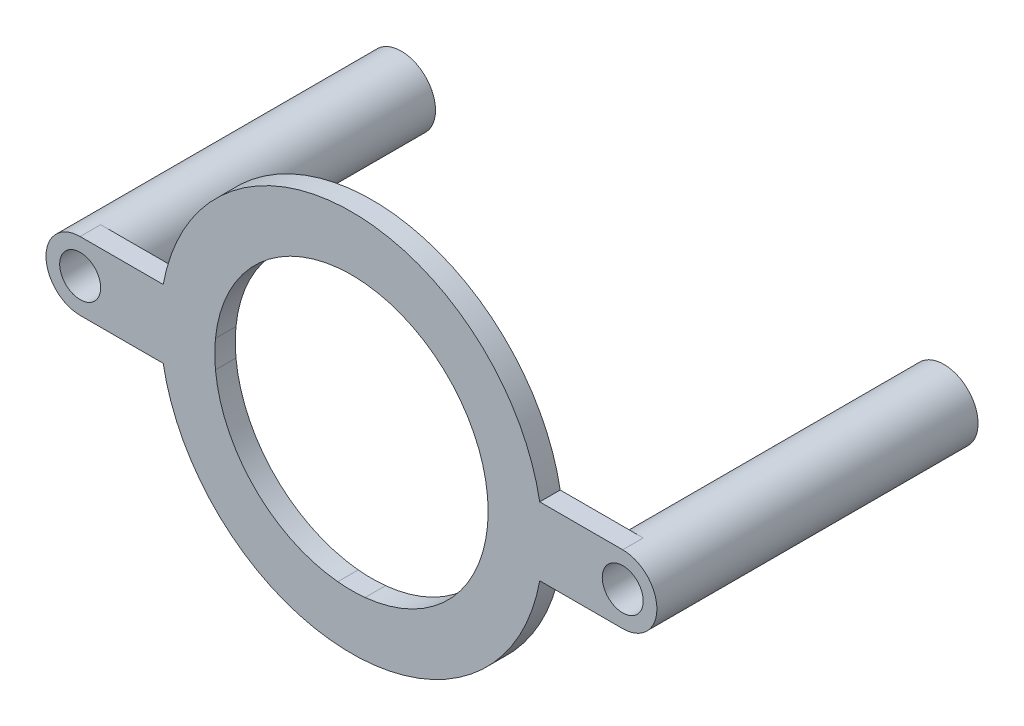
ISO-10303-21;
HEADER;
FILE_DESCRIPTION(('STEP AP214'),'2;1');
FILE_NAME('part.step','',(''),(''),'','','');
FILE_SCHEMA(('AUTOMOTIVE_DESIGN { 1 0 10303 214 1 1 1 1 }'));
ENDSEC;
DATA;
#1=APPLICATION_CONTEXT('core data for automotive mechanical design processes');
#2=APPLICATION_PROTOCOL_DEFINITION('international standard','automotive_design',2000,#1);
#3=PRODUCT_CONTEXT('',#1,'mechanical');
#4=PRODUCT('Part','Part','',(#3));
#5=PRODUCT_RELATED_PRODUCT_CATEGORY('part','',(#4));
#6=PRODUCT_DEFINITION_FORMATION('','',#4);
#7=PRODUCT_DEFINITION_CONTEXT('part definition',#1,'design');
#8=PRODUCT_DEFINITION('design','',#6,#7);
#9=PRODUCT_DEFINITION_SHAPE('','',#8);
#10=(LENGTH_UNIT() NAMED_UNIT(*) SI_UNIT(.MILLI.,.METRE.));
#11=(NAMED_UNIT(*) PLANE_ANGLE_UNIT() SI_UNIT($,.RADIAN.));
#12=(NAMED_UNIT(*) SI_UNIT($,.STERADIAN.) SOLID_ANGLE_UNIT());
#13=UNCERTAINTY_MEASURE_WITH_UNIT(LENGTH_MEASURE(1.E-05),#10,'distance_accuracy_value','');
#14=(GEOMETRIC_REPRESENTATION_CONTEXT(3) GLOBAL_UNCERTAINTY_ASSIGNED_CONTEXT((#13)) GLOBAL_UNIT_ASSIGNED_CONTEXT((#10,
#11,#12)) REPRESENTATION_CONTEXT('',''));
#15=CARTESIAN_POINT('',(0.,0.,0.));
#16=DIRECTION('',(0.,0.,1.));
#17=DIRECTION('',(1.,0.,0.));
#18=AXIS2_PLACEMENT_3D('',#15,#16,#17);
#19=CARTESIAN_POINT('',(0.,0.,0.));
#20=DIRECTION('',(0.,0.,1.));
#21=DIRECTION('',(1.,0.,0.));
#22=AXIS2_PLACEMENT_3D('',#19,#20,#21);
#23=PLANE('',#22);
#24=CARTESIAN_POINT('',(0.,0.,0.));
#25=DIRECTION('',(0.,0.,1.));
#26=DIRECTION('',(1.,0.,0.));
#27=AXIS2_PLACEMENT_3D('',#24,#25,#26);
#28=CIRCLE('',#27,10.);
#29=CARTESIAN_POINT('',(1.,-9.9498743710662,0.));
#30=VERTEX_POINT('',#29);
#31=CARTESIAN_POINT('',(9.9498743710662,-1.,0.));
#32=VERTEX_POINT('',#31);
#33=EDGE_CURVE('E12',#30,#32,#28,.T.);
#34=ORIENTED_EDGE('',*,*,#33,.T.);
#35=CARTESIAN_POINT('',(2.2291196666302E-13,0.,0.));
#36=DIRECTION('',(0.,0.,1.));
#37=DIRECTION('',(1.,0.,0.));
#38=AXIS2_PLACEMENT_3D('',#35,#36,#37);
#39=CIRCLE('',#38,9.99999999999978);
#40=CARTESIAN_POINT('',(9.9498743710662,1.,0.));
#41=VERTEX_POINT('',#40);
#42=EDGE_CURVE('E29',#32,#41,#39,.T.);
#43=ORIENTED_EDGE('',*,*,#42,.T.);
#44=CARTESIAN_POINT('',(0.,0.,0.));
#45=DIRECTION('',(0.,0.,1.));
#46=DIRECTION('',(1.,0.,0.));
#47=AXIS2_PLACEMENT_3D('',#44,#45,#46);
#48=CIRCLE('',#47,10.);
#49=CARTESIAN_POINT('',(1.,9.9498743710662,0.));
#50=VERTEX_POINT('',#49);
#51=EDGE_CURVE('E137',#41,#50,#48,.T.);
#52=ORIENTED_EDGE('',*,*,#51,.T.);
#53=CARTESIAN_POINT('',(0.,3.00974523081976E-13,0.));
#54=DIRECTION('',(0.,0.,1.));
#55=DIRECTION('',(1.,0.,0.));
#56=AXIS2_PLACEMENT_3D('',#53,#54,#55);
#57=CIRCLE('',#56,9.9999999999997);
#58=CARTESIAN_POINT('',(-1.,9.9498743710662,0.));
#59=VERTEX_POINT('',#58);
#60=EDGE_CURVE('E391',#50,#59,#57,.T.);
#61=ORIENTED_EDGE('',*,*,#60,.T.);
#62=CARTESIAN_POINT('',(0.,0.,0.));
#63=DIRECTION('',(0.,0.,1.));
#64=DIRECTION('',(1.,0.,0.));
#65=AXIS2_PLACEMENT_3D('',#62,#63,#64);
#66=CIRCLE('',#65,10.);
#67=CARTESIAN_POINT('',(-9.9498743710662,1.,0.));
#68=VERTEX_POINT('',#67);
#69=EDGE_CURVE('E384',#59,#68,#66,.T.);
#70=ORIENTED_EDGE('',*,*,#69,.T.);
#71=CARTESIAN_POINT('',(-3.21791204793698E-13,0.,0.));
#72=DIRECTION('',(0.,0.,1.));
#73=DIRECTION('',(1.,0.,0.));
#74=AXIS2_PLACEMENT_3D('',#71,#72,#73);
#75=CIRCLE('',#74,9.99999999999968);
#76=CARTESIAN_POINT('',(-9.9498743710662,-1.,0.));
#77=VERTEX_POINT('',#76);
#78=EDGE_CURVE('E380',#68,#77,#75,.T.);
#79=ORIENTED_EDGE('',*,*,#78,.T.);
#80=CARTESIAN_POINT('',(0.,0.,0.));
#81=DIRECTION('',(0.,0.,1.));
#82=DIRECTION('',(1.,0.,0.));
#83=AXIS2_PLACEMENT_3D('',#80,#81,#82);
#84=CIRCLE('',#83,10.);
#85=CARTESIAN_POINT('',(-1.,-9.9498743710662,0.));
#86=VERTEX_POINT('',#85);
#87=EDGE_CURVE('E375',#77,#86,#84,.T.);
#88=ORIENTED_EDGE('',*,*,#87,.T.);
#89=CARTESIAN_POINT('',(0.,-3.21791204793698E-13,0.));
#90=DIRECTION('',(0.,0.,1.));
#91=DIRECTION('',(1.,0.,0.));
#92=AXIS2_PLACEMENT_3D('',#89,#90,#91);
#93=CIRCLE('',#92,9.99999999999968);
#94=EDGE_CURVE('E337',#86,#30,#93,.T.);
#95=ORIENTED_EDGE('',*,*,#94,.T.);
#96=EDGE_LOOP('',(#34,#43,#52,#61,#70,#79,#88,#95));
#97=FACE_BOUND('',#96,.T.);
#98=CARTESIAN_POINT('',(-19.85,0.,0.));
#99=DIRECTION('',(0.,0.,-1.));
#100=DIRECTION('',(1.,0.,0.));
#101=AXIS2_PLACEMENT_3D('',#98,#99,#100);
#102=CIRCLE('',#101,2.5);
#103=CARTESIAN_POINT('',(-19.85,2.5,0.));
#104=VERTEX_POINT('',#103);
#105=CARTESIAN_POINT('',(-19.85,-2.5,0.));
#106=VERTEX_POINT('',#105);
#107=EDGE_CURVE('E327',#104,#106,#102,.T.);
#108=ORIENTED_EDGE('',*,*,#107,.F.);
#109=DIRECTION('',(1.,0.,0.));
#110=VECTOR('',#109,1.);
#111=CARTESIAN_POINT('',(-16.812488656978,2.5,0.));
#112=LINE('',#111,#110);
#113=CARTESIAN_POINT('',(-13.7749773139559,2.5,0.));
#114=VERTEX_POINT('',#113);
#115=EDGE_CURVE('E329',#104,#114,#112,.T.);
#116=ORIENTED_EDGE('',*,*,#115,.T.);
#117=CARTESIAN_POINT('',(0.,0.,0.));
#118=DIRECTION('',(0.,0.,1.));
#119=DIRECTION('',(1.,0.,0.));
#120=AXIS2_PLACEMENT_3D('',#117,#118,#119);
#121=CIRCLE('',#120,14.);
#122=CARTESIAN_POINT('',(13.7749773139559,2.5,0.));
#123=VERTEX_POINT('',#122);
#124=EDGE_CURVE('E342',#123,#114,#121,.T.);
#125=ORIENTED_EDGE('',*,*,#124,.F.);
#126=DIRECTION('',(-1.,0.,0.));
#127=VECTOR('',#126,1.);
#128=CARTESIAN_POINT('',(16.812488656978,2.5,0.));
#129=LINE('',#128,#127);
#130=CARTESIAN_POINT('',(19.85,2.5,0.));
#131=VERTEX_POINT('',#130);
#132=EDGE_CURVE('E356',#131,#123,#129,.T.);
#133=ORIENTED_EDGE('',*,*,#132,.F.);
#134=CARTESIAN_POINT('',(19.85,0.,0.));
#135=DIRECTION('',(0.,0.,1.));
#136=DIRECTION('',(-1.,0.,0.));
#137=AXIS2_PLACEMENT_3D('',#134,#135,#136);
#138=CIRCLE('',#137,2.5);
#139=CARTESIAN_POINT('',(19.85,-2.5,0.));
#140=VERTEX_POINT('',#139);
#141=EDGE_CURVE('E359',#131,#140,#138,.T.);
#142=ORIENTED_EDGE('',*,*,#141,.T.);
#143=DIRECTION('',(-1.,0.,0.));
#144=VECTOR('',#143,1.);
#145=CARTESIAN_POINT('',(16.812488656978,-2.5,0.));
#146=LINE('',#145,#144);
#147=CARTESIAN_POINT('',(13.7749773139559,-2.5,0.));
#148=VERTEX_POINT('',#147);
#149=EDGE_CURVE('E468',#140,#148,#146,.T.);
#150=ORIENTED_EDGE('',*,*,#149,.T.);
#151=CARTESIAN_POINT('',(0.,0.,0.));
#152=DIRECTION('',(0.,0.,1.));
#153=DIRECTION('',(1.,0.,0.));
#154=AXIS2_PLACEMENT_3D('',#151,#152,#153);
#155=CIRCLE('',#154,14.);
#156=CARTESIAN_POINT('',(-13.7749773139559,-2.5,0.));
#157=VERTEX_POINT('',#156);
#158=EDGE_CURVE('E461',#157,#148,#155,.T.);
#159=ORIENTED_EDGE('',*,*,#158,.F.);
#160=DIRECTION('',(1.,0.,0.));
#161=VECTOR('',#160,1.);
#162=CARTESIAN_POINT('',(-16.812488656978,-2.5,0.));
#163=LINE('',#162,#161);
#164=EDGE_CURVE('E332',#106,#157,#163,.T.);
#165=ORIENTED_EDGE('',*,*,#164,.F.);
#166=EDGE_LOOP('',(#108,#116,#125,#133,#142,#150,#159,#165));
#167=FACE_BOUND('',#166,.T.);
#168=ADVANCED_FACE('F20',(#97,#167),#23,.F.);
#169=CARTESIAN_POINT('',(-16.812488656978,-2.5,1.5));
#170=DIRECTION('',(0.,1.,0.));
#171=DIRECTION('',(0.,0.,1.));
#172=AXIS2_PLACEMENT_3D('',#169,#170,#171);
#173=PLANE('',#172);
#174=ORIENTED_EDGE('',*,*,#164,.T.);
#175=DIRECTION('',(0.,0.,-1.));
#176=VECTOR('',#175,1.);
#177=CARTESIAN_POINT('',(-13.7749773139559,-2.5,1.5));
#178=LINE('',#177,#176);
#179=CARTESIAN_POINT('',(-13.7749773139559,-2.5,1.5));
#180=VERTEX_POINT('',#179);
#181=EDGE_CURVE('E466',#180,#157,#178,.T.);
#182=ORIENTED_EDGE('',*,*,#181,.F.);
#183=DIRECTION('',(1.,0.,0.));
#184=VECTOR('',#183,1.);
#185=CARTESIAN_POINT('',(-16.812488656978,-2.5,1.5));
#186=LINE('',#185,#184);
#187=CARTESIAN_POINT('',(-19.85,-2.5,1.5));
#188=VERTEX_POINT('',#187);
#189=EDGE_CURVE('E480',#188,#180,#186,.T.);
#190=ORIENTED_EDGE('',*,*,#189,.F.);
#191=DIRECTION('',(0.,0.,-1.));
#192=VECTOR('',#191,1.);
#193=CARTESIAN_POINT('',(-19.85,-2.5,1.5));
#194=LINE('',#193,#192);
#195=EDGE_CURVE('E347',#188,#106,#194,.T.);
#196=ORIENTED_EDGE('',*,*,#195,.T.);
#197=EDGE_LOOP('',(#174,#182,#190,#196));
#198=FACE_BOUND('',#197,.T.);
#199=ADVANCED_FACE('F320',(#198),#173,.F.);
#200=CARTESIAN_POINT('',(0.,0.,1.5));
#201=DIRECTION('',(0.,0.,-1.));
#202=DIRECTION('',(-1.,0.,0.));
#203=AXIS2_PLACEMENT_3D('',#200,#201,#202);
#204=CYLINDRICAL_SURFACE('',#203,14.);
#205=ORIENTED_EDGE('',*,*,#158,.T.);
#206=DIRECTION('',(0.,0.,-1.));
#207=VECTOR('',#206,1.);
#208=CARTESIAN_POINT('',(13.7749773139559,-2.5,1.5));
#209=LINE('',#208,#207);
#210=CARTESIAN_POINT('',(13.7749773139559,-2.5,1.5));
#211=VERTEX_POINT('',#210);
#212=EDGE_CURVE('E464',#211,#148,#209,.T.);
#213=ORIENTED_EDGE('',*,*,#212,.F.);
#214=CARTESIAN_POINT('',(0.,0.,1.5));
#215=DIRECTION('',(0.,0.,1.));
#216=DIRECTION('',(1.,0.,0.));
#217=AXIS2_PLACEMENT_3D('',#214,#215,#216);
#218=CIRCLE('',#217,14.);
#219=EDGE_CURVE('E476',#180,#211,#218,.T.);
#220=ORIENTED_EDGE('',*,*,#219,.F.);
#221=ORIENTED_EDGE('',*,*,#181,.T.);
#222=EDGE_LOOP('',(#205,#213,#220,#221));
#223=FACE_BOUND('',#222,.T.);
#224=ADVANCED_FACE('F323',(#223),#204,.T.);
#225=CARTESIAN_POINT('',(16.812488656978,-2.5,1.5));
#226=DIRECTION('',(0.,-1.,0.));
#227=DIRECTION('',(1.,0.,0.));
#228=AXIS2_PLACEMENT_3D('',#225,#226,#227);
#229=PLANE('',#228);
#230=ORIENTED_EDGE('',*,*,#149,.F.);
#231=DIRECTION('',(0.,0.,-1.));
#232=VECTOR('',#231,1.);
#233=CARTESIAN_POINT('',(19.85,-2.5,1.5));
#234=LINE('',#233,#232);
#235=CARTESIAN_POINT('',(19.85,-2.5,1.5));
#236=VERTEX_POINT('',#235);
#237=EDGE_CURVE('E482',#236,#140,#234,.T.);
#238=ORIENTED_EDGE('',*,*,#237,.F.);
#239=DIRECTION('',(-1.,0.,0.));
#240=VECTOR('',#239,1.);
#241=CARTESIAN_POINT('',(16.812488656978,-2.5,1.5));
#242=LINE('',#241,#240);
#243=EDGE_CURVE('E473',#236,#211,#242,.T.);
#244=ORIENTED_EDGE('',*,*,#243,.T.);
#245=ORIENTED_EDGE('',*,*,#212,.T.);
#246=EDGE_LOOP('',(#230,#238,#244,#245));
#247=FACE_BOUND('',#246,.T.);
#248=ADVANCED_FACE('F451',(#247),#229,.T.);
#249=CARTESIAN_POINT('',(19.85,0.,1.5));
#250=DIRECTION('',(0.,0.,-1.));
#251=DIRECTION('',(-1.,0.,0.));
#252=AXIS2_PLACEMENT_3D('',#249,#250,#251);
#253=CYLINDRICAL_SURFACE('',#252,2.5);
#254=ORIENTED_EDGE('',*,*,#237,.T.);
#255=ORIENTED_EDGE('',*,*,#141,.F.);
#256=DIRECTION('',(0.,0.,-1.));
#257=VECTOR('',#256,1.);
#258=CARTESIAN_POINT('',(19.85,2.5,1.5));
#259=LINE('',#258,#257);
#260=CARTESIAN_POINT('',(19.85,2.5,1.5));
#261=VERTEX_POINT('',#260);
#262=EDGE_CURVE('E505',#261,#131,#259,.T.);
#263=ORIENTED_EDGE('',*,*,#262,.F.);
#264=CARTESIAN_POINT('',(19.85,0.,1.5));
#265=DIRECTION('',(0.,0.,1.));
#266=DIRECTION('',(1.,0.,0.));
#267=AXIS2_PLACEMENT_3D('',#264,#265,#266);
#268=CIRCLE('',#267,2.5);
#269=EDGE_CURVE('E262',#236,#261,#268,.T.);
#270=ORIENTED_EDGE('',*,*,#269,.F.);
#271=EDGE_LOOP('',(#254,#255,#263,#270));
#272=FACE_BOUND('',#271,.T.);
#273=CARTESIAN_POINT('',(19.85,0.,-22.));
#274=DIRECTION('',(0.,0.,1.));
#275=DIRECTION('',(-1.,0.,0.));
#276=AXIS2_PLACEMENT_3D('',#273,#274,#275);
#277=CIRCLE('',#276,2.5);
#278=CARTESIAN_POINT('',(17.35,0.,-22.));
#279=VERTEX_POINT('',#278);
#280=EDGE_CURVE('E257',#279,#279,#277,.T.);
#281=ORIENTED_EDGE('',*,*,#280,.T.);
#282=EDGE_LOOP('',(#281));
#283=FACE_BOUND('',#282,.T.);
#284=ADVANCED_FACE('F447',(#272,#283),#253,.T.);
#285=CARTESIAN_POINT('',(16.812488656978,2.5,1.5));
#286=DIRECTION('',(0.,-1.,0.));
#287=DIRECTION('',(0.,0.,-1.));
#288=AXIS2_PLACEMENT_3D('',#285,#286,#287);
#289=PLANE('',#288);
#290=ORIENTED_EDGE('',*,*,#132,.T.);
#291=DIRECTION('',(0.,0.,-1.));
#292=VECTOR('',#291,1.);
#293=CARTESIAN_POINT('',(13.7749773139559,2.5,1.5));
#294=LINE('',#293,#292);
#295=CARTESIAN_POINT('',(13.7749773139559,2.5,1.5));
#296=VERTEX_POINT('',#295);
#297=EDGE_CURVE('E253',#296,#123,#294,.T.);
#298=ORIENTED_EDGE('',*,*,#297,.F.);
#299=DIRECTION('',(-1.,0.,0.));
#300=VECTOR('',#299,1.);
#301=CARTESIAN_POINT('',(16.812488656978,2.5,1.5));
#302=LINE('',#301,#300);
#303=EDGE_CURVE('E249',#261,#296,#302,.T.);
#304=ORIENTED_EDGE('',*,*,#303,.F.);
#305=ORIENTED_EDGE('',*,*,#262,.T.);
#306=EDGE_LOOP('',(#290,#298,#304,#305));
#307=FACE_BOUND('',#306,.T.);
#308=ADVANCED_FACE('F444',(#307),#289,.F.);
#309=CARTESIAN_POINT('',(0.,0.,1.5));
#310=DIRECTION('',(0.,0.,-1.));
#311=DIRECTION('',(-1.,0.,0.));
#312=AXIS2_PLACEMENT_3D('',#309,#310,#311);
#313=CYLINDRICAL_SURFACE('',#312,14.);
#314=ORIENTED_EDGE('',*,*,#124,.T.);
#315=DIRECTION('',(0.,0.,-1.));
#316=VECTOR('',#315,1.);
#317=CARTESIAN_POINT('',(-13.7749773139559,2.5,1.5));
#318=LINE('',#317,#316);
#319=CARTESIAN_POINT('',(-13.7749773139559,2.5,1.5));
#320=VERTEX_POINT('',#319);
#321=EDGE_CURVE('E245',#320,#114,#318,.T.);
#322=ORIENTED_EDGE('',*,*,#321,.F.);
#323=CARTESIAN_POINT('',(0.,0.,1.5));
#324=DIRECTION('',(0.,0.,1.));
#325=DIRECTION('',(1.,0.,0.));
#326=AXIS2_PLACEMENT_3D('',#323,#324,#325);
#327=CIRCLE('',#326,14.);
#328=EDGE_CURVE('E241',#296,#320,#327,.T.);
#329=ORIENTED_EDGE('',*,*,#328,.F.);
#330=ORIENTED_EDGE('',*,*,#297,.T.);
#331=EDGE_LOOP('',(#314,#322,#329,#330));
#332=FACE_BOUND('',#331,.T.);
#333=ADVANCED_FACE('F353',(#332),#313,.T.);
#334=CARTESIAN_POINT('',(-16.812488656978,2.5,1.5));
#335=DIRECTION('',(0.,1.,0.));
#336=DIRECTION('',(0.,0.,1.));
#337=AXIS2_PLACEMENT_3D('',#334,#335,#336);
#338=PLANE('',#337);
#339=ORIENTED_EDGE('',*,*,#115,.F.);
#340=DIRECTION('',(0.,0.,-1.));
#341=VECTOR('',#340,1.);
#342=CARTESIAN_POINT('',(-19.85,2.5,1.5));
#343=LINE('',#342,#341);
#344=CARTESIAN_POINT('',(-19.85,2.5,1.5));
#345=VERTEX_POINT('',#344);
#346=EDGE_CURVE('E236',#345,#104,#343,.T.);
#347=ORIENTED_EDGE('',*,*,#346,.F.);
#348=DIRECTION('',(1.,0.,0.));
#349=VECTOR('',#348,1.);
#350=CARTESIAN_POINT('',(-16.812488656978,2.5,1.5));
#351=LINE('',#350,#349);
#352=EDGE_CURVE('E233',#345,#320,#351,.T.);
#353=ORIENTED_EDGE('',*,*,#352,.T.);
#354=ORIENTED_EDGE('',*,*,#321,.T.);
#355=EDGE_LOOP('',(#339,#347,#353,#354));
#356=FACE_BOUND('',#355,.T.);
#357=ADVANCED_FACE('F340',(#356),#338,.T.);
#358=CARTESIAN_POINT('',(0.,0.,1.5));
#359=DIRECTION('',(0.,0.,-1.));
#360=DIRECTION('',(-1.,0.,0.));
#361=AXIS2_PLACEMENT_3D('',#358,#359,#360);
#362=CYLINDRICAL_SURFACE('',#361,10.);
#363=ORIENTED_EDGE('',*,*,#33,.F.);
#364=DIRECTION('',(0.,0.,-1.));
#365=VECTOR('',#364,1.);
#366=CARTESIAN_POINT('',(1.,-9.9498743710662,1.5));
#367=LINE('',#366,#365);
#368=CARTESIAN_POINT('',(1.,-9.9498743710662,1.5));
#369=VERTEX_POINT('',#368);
#370=EDGE_CURVE('E228',#369,#30,#367,.T.);
#371=ORIENTED_EDGE('',*,*,#370,.F.);
#372=CARTESIAN_POINT('',(0.,0.,1.5));
#373=DIRECTION('',(0.,0.,1.));
#374=DIRECTION('',(1.,0.,0.));
#375=AXIS2_PLACEMENT_3D('',#372,#373,#374);
#376=CIRCLE('',#375,10.);
#377=CARTESIAN_POINT('',(9.9498743710662,-1.,1.5));
#378=VERTEX_POINT('',#377);
#379=EDGE_CURVE('E221',#369,#378,#376,.T.);
#380=ORIENTED_EDGE('',*,*,#379,.T.);
#381=DIRECTION('',(0.,0.,-1.));
#382=VECTOR('',#381,1.);
#383=CARTESIAN_POINT('',(9.9498743710662,-1.,1.5));
#384=LINE('',#383,#382);
#385=EDGE_CURVE('E146',#378,#32,#384,.T.);
#386=ORIENTED_EDGE('',*,*,#385,.T.);
#387=EDGE_LOOP('',(#363,#371,#380,#386));
#388=FACE_BOUND('',#387,.T.);
#389=ADVANCED_FACE('F435',(#388),#362,.F.);
#390=CARTESIAN_POINT('',(0.,-3.21791204793698E-13,1.5));
#391=DIRECTION('',(0.,0.,-1.));
#392=DIRECTION('',(-1.,0.,0.));
#393=AXIS2_PLACEMENT_3D('',#390,#391,#392);
#394=CYLINDRICAL_SURFACE('',#393,9.99999999999968);
#395=ORIENTED_EDGE('',*,*,#94,.F.);
#396=DIRECTION('',(0.,0.,-1.));
#397=VECTOR('',#396,1.);
#398=CARTESIAN_POINT('',(-1.,-9.9498743710662,1.5));
#399=LINE('',#398,#397);
#400=CARTESIAN_POINT('',(-1.,-9.9498743710662,1.5));
#401=VERTEX_POINT('',#400);
#402=EDGE_CURVE('E213',#401,#86,#399,.T.);
#403=ORIENTED_EDGE('',*,*,#402,.F.);
#404=CARTESIAN_POINT('',(0.,-3.21791204793698E-13,1.5));
#405=DIRECTION('',(0.,0.,1.));
#406=DIRECTION('',(1.,0.,0.));
#407=AXIS2_PLACEMENT_3D('',#404,#405,#406);
#408=CIRCLE('',#407,9.99999999999968);
#409=EDGE_CURVE('E209',#401,#369,#408,.T.);
#410=ORIENTED_EDGE('',*,*,#409,.T.);
#411=ORIENTED_EDGE('',*,*,#370,.T.);
#412=EDGE_LOOP('',(#395,#403,#410,#411));
#413=FACE_BOUND('',#412,.T.);
#414=ADVANCED_FACE('F432',(#413),#394,.F.);
#415=CARTESIAN_POINT('',(0.,0.,1.5));
#416=DIRECTION('',(0.,0.,-1.));
#417=DIRECTION('',(-1.,0.,0.));
#418=AXIS2_PLACEMENT_3D('',#415,#416,#417);
#419=CYLINDRICAL_SURFACE('',#418,10.);
#420=ORIENTED_EDGE('',*,*,#87,.F.);
#421=DIRECTION('',(0.,0.,-1.));
#422=VECTOR('',#421,1.);
#423=CARTESIAN_POINT('',(-9.9498743710662,-1.,1.5));
#424=LINE('',#423,#422);
#425=CARTESIAN_POINT('',(-9.9498743710662,-1.,1.5));
#426=VERTEX_POINT('',#425);
#427=EDGE_CURVE('E201',#426,#77,#424,.T.);
#428=ORIENTED_EDGE('',*,*,#427,.F.);
#429=CARTESIAN_POINT('',(0.,0.,1.5));
#430=DIRECTION('',(0.,0.,1.));
#431=DIRECTION('',(1.,0.,0.));
#432=AXIS2_PLACEMENT_3D('',#429,#430,#431);
#433=CIRCLE('',#432,10.);
#434=EDGE_CURVE('E196',#426,#401,#433,.T.);
#435=ORIENTED_EDGE('',*,*,#434,.T.);
#436=ORIENTED_EDGE('',*,*,#402,.T.);
#437=EDGE_LOOP('',(#420,#428,#435,#436));
#438=FACE_BOUND('',#437,.T.);
#439=ADVANCED_FACE('F415',(#438),#419,.F.);
#440=CARTESIAN_POINT('',(-3.21791204793698E-13,0.,1.5));
#441=DIRECTION('',(0.,0.,-1.));
#442=DIRECTION('',(-1.,0.,0.));
#443=AXIS2_PLACEMENT_3D('',#440,#441,#442);
#444=CYLINDRICAL_SURFACE('',#443,9.99999999999968);
#445=ORIENTED_EDGE('',*,*,#78,.F.);
#446=DIRECTION('',(0.,0.,-1.));
#447=VECTOR('',#446,1.);
#448=CARTESIAN_POINT('',(-9.9498743710662,1.,1.5));
#449=LINE('',#448,#447);
#450=CARTESIAN_POINT('',(-9.9498743710662,1.,1.5));
#451=VERTEX_POINT('',#450);
#452=EDGE_CURVE('E191',#451,#68,#449,.T.);
#453=ORIENTED_EDGE('',*,*,#452,.F.);
#454=CARTESIAN_POINT('',(-3.21791204793698E-13,0.,1.5));
#455=DIRECTION('',(0.,0.,1.));
#456=DIRECTION('',(1.,0.,0.));
#457=AXIS2_PLACEMENT_3D('',#454,#455,#456);
#458=CIRCLE('',#457,9.99999999999968);
#459=EDGE_CURVE('E187',#451,#426,#458,.T.);
#460=ORIENTED_EDGE('',*,*,#459,.T.);
#461=ORIENTED_EDGE('',*,*,#427,.T.);
#462=EDGE_LOOP('',(#445,#453,#460,#461));
#463=FACE_BOUND('',#462,.T.);
#464=ADVANCED_FACE('F409',(#463),#444,.F.);
#465=CARTESIAN_POINT('',(0.,0.,1.5));
#466=DIRECTION('',(0.,0.,-1.));
#467=DIRECTION('',(-1.,0.,0.));
#468=AXIS2_PLACEMENT_3D('',#465,#466,#467);
#469=CYLINDRICAL_SURFACE('',#468,10.);
#470=ORIENTED_EDGE('',*,*,#69,.F.);
#471=DIRECTION('',(0.,0.,-1.));
#472=VECTOR('',#471,1.);
#473=CARTESIAN_POINT('',(-1.,9.9498743710662,1.5));
#474=LINE('',#473,#472);
#475=CARTESIAN_POINT('',(-1.,9.9498743710662,1.5));
#476=VERTEX_POINT('',#475);
#477=EDGE_CURVE('E179',#476,#59,#474,.T.);
#478=ORIENTED_EDGE('',*,*,#477,.F.);
#479=CARTESIAN_POINT('',(0.,0.,1.5));
#480=DIRECTION('',(0.,0.,1.));
#481=DIRECTION('',(1.,0.,0.));
#482=AXIS2_PLACEMENT_3D('',#479,#480,#481);
#483=CIRCLE('',#482,10.);
#484=EDGE_CURVE('E174',#476,#451,#483,.T.);
#485=ORIENTED_EDGE('',*,*,#484,.T.);
#486=ORIENTED_EDGE('',*,*,#452,.T.);
#487=EDGE_LOOP('',(#470,#478,#485,#486));
#488=FACE_BOUND('',#487,.T.);
#489=ADVANCED_FACE('F410',(#488),#469,.F.);
#490=CARTESIAN_POINT('',(0.,3.00974523081976E-13,1.5));
#491=DIRECTION('',(0.,0.,-1.));
#492=DIRECTION('',(-1.,0.,0.));
#493=AXIS2_PLACEMENT_3D('',#490,#491,#492);
#494=CYLINDRICAL_SURFACE('',#493,9.9999999999997);
#495=ORIENTED_EDGE('',*,*,#60,.F.);
#496=DIRECTION('',(0.,0.,-1.));
#497=VECTOR('',#496,1.);
#498=CARTESIAN_POINT('',(1.,9.9498743710662,1.5));
#499=LINE('',#498,#497);
#500=CARTESIAN_POINT('',(1.,9.9498743710662,1.5));
#501=VERTEX_POINT('',#500);
#502=EDGE_CURVE('E170',#501,#50,#499,.T.);
#503=ORIENTED_EDGE('',*,*,#502,.F.);
#504=CARTESIAN_POINT('',(0.,3.00974523081976E-13,1.5));
#505=DIRECTION('',(0.,0.,1.));
#506=DIRECTION('',(1.,0.,0.));
#507=AXIS2_PLACEMENT_3D('',#504,#505,#506);
#508=CIRCLE('',#507,9.9999999999997);
#509=EDGE_CURVE('E140',#501,#476,#508,.T.);
#510=ORIENTED_EDGE('',*,*,#509,.T.);
#511=ORIENTED_EDGE('',*,*,#477,.T.);
#512=EDGE_LOOP('',(#495,#503,#510,#511));
#513=FACE_BOUND('',#512,.T.);
#514=ADVANCED_FACE('F419',(#513),#494,.F.);
#515=CARTESIAN_POINT('',(0.,0.,1.5));
#516=DIRECTION('',(0.,0.,-1.));
#517=DIRECTION('',(-1.,0.,0.));
#518=AXIS2_PLACEMENT_3D('',#515,#516,#517);
#519=CYLINDRICAL_SURFACE('',#518,10.);
#520=ORIENTED_EDGE('',*,*,#51,.F.);
#521=DIRECTION('',(0.,0.,-1.));
#522=VECTOR('',#521,1.);
#523=CARTESIAN_POINT('',(9.9498743710662,1.,1.5));
#524=LINE('',#523,#522);
#525=CARTESIAN_POINT('',(9.9498743710662,1.,1.5));
#526=VERTEX_POINT('',#525);
#527=EDGE_CURVE('E130',#526,#41,#524,.T.);
#528=ORIENTED_EDGE('',*,*,#527,.F.);
#529=CARTESIAN_POINT('',(0.,0.,1.5));
#530=DIRECTION('',(0.,0.,1.));
#531=DIRECTION('',(1.,0.,0.));
#532=AXIS2_PLACEMENT_3D('',#529,#530,#531);
#533=CIRCLE('',#532,10.);
#534=EDGE_CURVE('E135',#526,#501,#533,.T.);
#535=ORIENTED_EDGE('',*,*,#534,.T.);
#536=ORIENTED_EDGE('',*,*,#502,.T.);
#537=EDGE_LOOP('',(#520,#528,#535,#536));
#538=FACE_BOUND('',#537,.T.);
#539=ADVANCED_FACE('F132',(#538),#519,.F.);
#540=CARTESIAN_POINT('',(2.2291196666302E-13,0.,1.5));
#541=DIRECTION('',(0.,0.,-1.));
#542=DIRECTION('',(-1.,0.,0.));
#543=AXIS2_PLACEMENT_3D('',#540,#541,#542);
#544=CYLINDRICAL_SURFACE('',#543,9.99999999999978);
#545=ORIENTED_EDGE('',*,*,#42,.F.);
#546=ORIENTED_EDGE('',*,*,#385,.F.);
#547=CARTESIAN_POINT('',(2.2291196666302E-13,0.,1.5));
#548=DIRECTION('',(0.,0.,1.));
#549=DIRECTION('',(1.,0.,0.));
#550=AXIS2_PLACEMENT_3D('',#547,#548,#549);
#551=CIRCLE('',#550,9.99999999999978);
#552=EDGE_CURVE('E144',#378,#526,#551,.T.);
#553=ORIENTED_EDGE('',*,*,#552,.T.);
#554=ORIENTED_EDGE('',*,*,#527,.T.);
#555=EDGE_LOOP('',(#545,#546,#553,#554));
#556=FACE_BOUND('',#555,.T.);
#557=ADVANCED_FACE('F145',(#556),#544,.F.);
#558=CARTESIAN_POINT('',(19.85,0.,1.5));
#559=DIRECTION('',(0.,0.,-1.));
#560=DIRECTION('',(-1.,0.,0.));
#561=AXIS2_PLACEMENT_3D('',#558,#559,#560);
#562=CYLINDRICAL_SURFACE('',#561,1.5);
#563=CARTESIAN_POINT('',(19.85,0.,1.5));
#564=DIRECTION('',(0.,0.,1.));
#565=DIRECTION('',(1.,0.,0.));
#566=AXIS2_PLACEMENT_3D('',#563,#564,#565);
#567=CIRCLE('',#566,1.5);
#568=CARTESIAN_POINT('',(21.35,0.,1.5));
#569=VERTEX_POINT('',#568);
#570=EDGE_CURVE('E150',#569,#569,#567,.T.);
#571=ORIENTED_EDGE('',*,*,#570,.T.);
#572=EDGE_LOOP('',(#571));
#573=FACE_BOUND('',#572,.T.);
#574=CARTESIAN_POINT('',(19.85,0.,-22.));
#575=DIRECTION('',(0.,0.,-1.));
#576=DIRECTION('',(-1.,0.,0.));
#577=AXIS2_PLACEMENT_3D('',#574,#575,#576);
#578=CIRCLE('',#577,1.5);
#579=CARTESIAN_POINT('',(18.35,0.,-22.));
#580=VERTEX_POINT('',#579);
#581=EDGE_CURVE('E290',#580,#580,#578,.F.);
#582=ORIENTED_EDGE('',*,*,#581,.F.);
#583=EDGE_LOOP('',(#582));
#584=FACE_BOUND('',#583,.T.);
#585=ADVANCED_FACE('F307',(#573,#584),#562,.F.);
#586=CARTESIAN_POINT('',(-19.85,0.,1.5));
#587=DIRECTION('',(0.,0.,-1.));
#588=DIRECTION('',(-1.,0.,0.));
#589=AXIS2_PLACEMENT_3D('',#586,#587,#588);
#590=CYLINDRICAL_SURFACE('',#589,1.5);
#591=CARTESIAN_POINT('',(-19.85,0.,1.5));
#592=DIRECTION('',(0.,0.,-1.));
#593=DIRECTION('',(1.,0.,0.));
#594=AXIS2_PLACEMENT_3D('',#591,#592,#593);
#595=CIRCLE('',#594,1.5);
#596=CARTESIAN_POINT('',(-18.35,0.,1.5));
#597=VERTEX_POINT('',#596);
#598=EDGE_CURVE('E285',#597,#597,#595,.T.);
#599=ORIENTED_EDGE('',*,*,#598,.F.);
#600=EDGE_LOOP('',(#599));
#601=FACE_BOUND('',#600,.T.);
#602=CARTESIAN_POINT('',(-19.85,0.,-22.));
#603=DIRECTION('',(0.,0.,-1.));
#604=DIRECTION('',(-1.,0.,0.));
#605=AXIS2_PLACEMENT_3D('',#602,#603,#604);
#606=CIRCLE('',#605,1.5);
#607=CARTESIAN_POINT('',(-21.35,0.,-22.));
#608=VERTEX_POINT('',#607);
#609=EDGE_CURVE('E280',#608,#608,#606,.T.);
#610=ORIENTED_EDGE('',*,*,#609,.T.);
#611=EDGE_LOOP('',(#610));
#612=FACE_BOUND('',#611,.T.);
#613=ADVANCED_FACE('F309',(#601,#612),#590,.F.);
#614=CARTESIAN_POINT('',(-19.85,0.,1.5));
#615=DIRECTION('',(0.,0.,-1.));
#616=DIRECTION('',(-1.,0.,0.));
#617=AXIS2_PLACEMENT_3D('',#614,#615,#616);
#618=CYLINDRICAL_SURFACE('',#617,2.5);
#619=ORIENTED_EDGE('',*,*,#346,.T.);
#620=ORIENTED_EDGE('',*,*,#107,.T.);
#621=ORIENTED_EDGE('',*,*,#195,.F.);
#622=CARTESIAN_POINT('',(-19.85,0.,1.5));
#623=DIRECTION('',(0.,0.,-1.));
#624=DIRECTION('',(1.,0.,0.));
#625=AXIS2_PLACEMENT_3D('',#622,#623,#624);
#626=CIRCLE('',#625,2.5);
#627=EDGE_CURVE('E277',#188,#345,#626,.T.);
#628=ORIENTED_EDGE('',*,*,#627,.T.);
#629=EDGE_LOOP('',(#619,#620,#621,#628));
#630=FACE_BOUND('',#629,.T.);
#631=CARTESIAN_POINT('',(-19.85,0.,-22.));
#632=DIRECTION('',(0.,0.,-1.));
#633=DIRECTION('',(1.,0.,0.));
#634=AXIS2_PLACEMENT_3D('',#631,#632,#633);
#635=CIRCLE('',#634,2.5);
#636=CARTESIAN_POINT('',(-17.35,0.,-22.));
#637=VERTEX_POINT('',#636);
#638=EDGE_CURVE('E272',#637,#637,#635,.T.);
#639=ORIENTED_EDGE('',*,*,#638,.F.);
#640=EDGE_LOOP('',(#639));
#641=FACE_BOUND('',#640,.T.);
#642=ADVANCED_FACE('F315',(#630,#641),#618,.T.);
#643=CARTESIAN_POINT('',(0.,0.,1.5));
#644=DIRECTION('',(0.,0.,1.));
#645=DIRECTION('',(1.,0.,0.));
#646=AXIS2_PLACEMENT_3D('',#643,#644,#645);
#647=PLANE('',#646);
#648=ORIENTED_EDGE('',*,*,#598,.T.);
#649=EDGE_LOOP('',(#648));
#650=FACE_BOUND('',#649,.T.);
#651=ORIENTED_EDGE('',*,*,#570,.F.);
#652=EDGE_LOOP('',(#651));
#653=FACE_BOUND('',#652,.T.);
#654=ORIENTED_EDGE('',*,*,#379,.F.);
#655=ORIENTED_EDGE('',*,*,#409,.F.);
#656=ORIENTED_EDGE('',*,*,#434,.F.);
#657=ORIENTED_EDGE('',*,*,#459,.F.);
#658=ORIENTED_EDGE('',*,*,#484,.F.);
#659=ORIENTED_EDGE('',*,*,#509,.F.);
#660=ORIENTED_EDGE('',*,*,#534,.F.);
#661=ORIENTED_EDGE('',*,*,#552,.F.);
#662=EDGE_LOOP('',(#654,#655,#656,#657,#658,#659,#660,#661));
#663=FACE_BOUND('',#662,.T.);
#664=ORIENTED_EDGE('',*,*,#189,.T.);
#665=ORIENTED_EDGE('',*,*,#219,.T.);
#666=ORIENTED_EDGE('',*,*,#243,.F.);
#667=ORIENTED_EDGE('',*,*,#269,.T.);
#668=ORIENTED_EDGE('',*,*,#303,.T.);
#669=ORIENTED_EDGE('',*,*,#328,.T.);
#670=ORIENTED_EDGE('',*,*,#352,.F.);
#671=ORIENTED_EDGE('',*,*,#627,.F.);
#672=EDGE_LOOP('',(#664,#665,#666,#667,#668,#669,#670,#671));
#673=FACE_BOUND('',#672,.T.);
#674=ADVANCED_FACE('F151',(#650,#653,#663,#673),#647,.T.);
#675=CARTESIAN_POINT('',(0.,0.,-22.));
#676=DIRECTION('',(0.,0.,-1.));
#677=DIRECTION('',(1.,0.,0.));
#678=AXIS2_PLACEMENT_3D('',#675,#676,#677);
#679=PLANE('',#678);
#680=ORIENTED_EDGE('',*,*,#581,.T.);
#681=EDGE_LOOP('',(#680));
#682=FACE_BOUND('',#681,.T.);
#683=ORIENTED_EDGE('',*,*,#280,.F.);
#684=EDGE_LOOP('',(#683));
#685=FACE_BOUND('',#684,.T.);
#686=ADVANCED_FACE('F304',(#682,#685),#679,.T.);
#687=CARTESIAN_POINT('',(0.,0.,-22.));
#688=DIRECTION('',(0.,0.,-1.));
#689=DIRECTION('',(1.,0.,0.));
#690=AXIS2_PLACEMENT_3D('',#687,#688,#689);
#691=PLANE('',#690);
#692=ORIENTED_EDGE('',*,*,#609,.F.);
#693=EDGE_LOOP('',(#692));
#694=FACE_BOUND('',#693,.T.);
#695=ORIENTED_EDGE('',*,*,#638,.T.);
#696=EDGE_LOOP('',(#695));
#697=FACE_BOUND('',#696,.T.);
#698=ADVANCED_FACE('F516',(#694,#697),#691,.T.);
#699=CLOSED_SHELL('',(#168,#199,#224,#248,#284,#308,#333,#357,#389,#414,#439,#464,#489,#514,
#539,#557,#585,#613,#642,#674,#686,#698));
#700=MANIFOLD_SOLID_BREP('B1',#699);
#701=ADVANCED_BREP_SHAPE_REPRESENTATION('',(#18,#700),#14);
#702=SHAPE_DEFINITION_REPRESENTATION(#9,#701);
ENDSEC;
END-ISO-10303-21;
